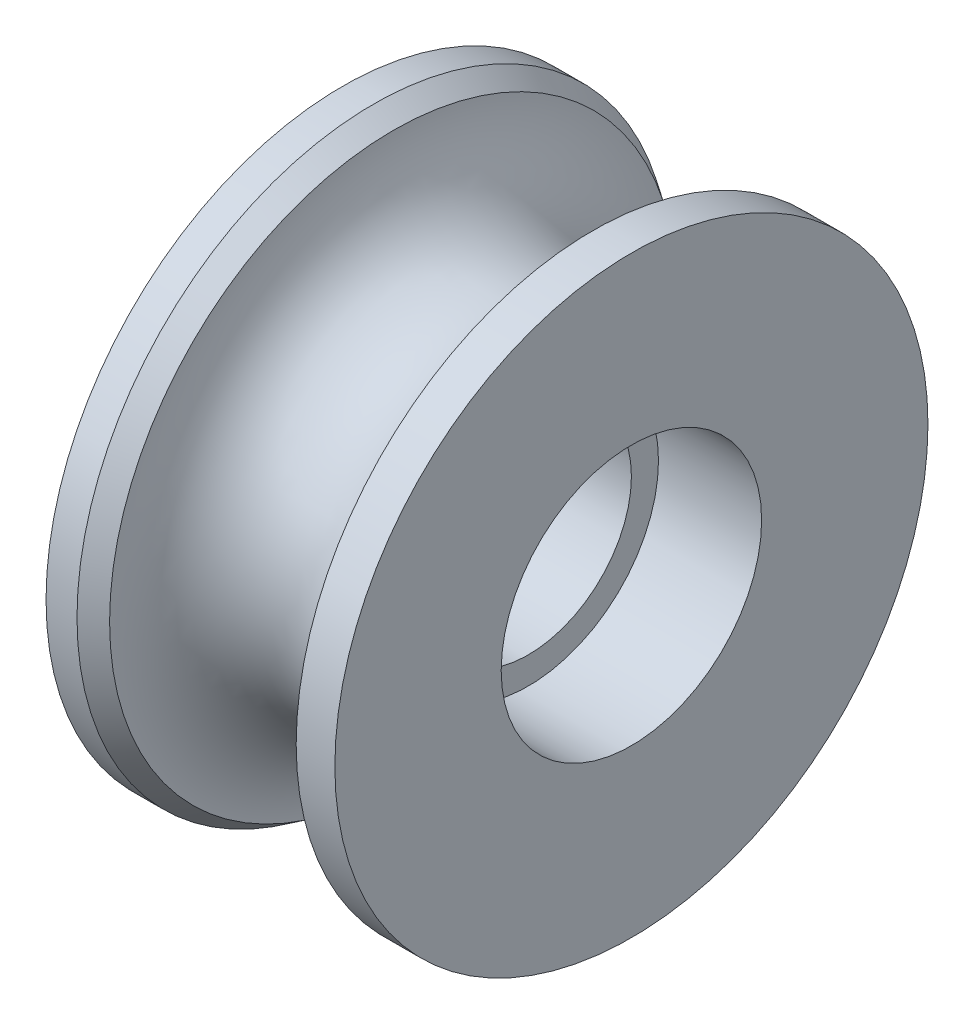
ISO-10303-21;
HEADER;
FILE_DESCRIPTION(('STEP AP214'),'2;1');
FILE_NAME('part.step','',(''),(''),'','','');
FILE_SCHEMA(('AUTOMOTIVE_DESIGN { 1 0 10303 214 1 1 1 1 }'));
ENDSEC;
DATA;
#1=APPLICATION_CONTEXT('core data for automotive mechanical design processes');
#2=APPLICATION_PROTOCOL_DEFINITION('international standard','automotive_design',2000,#1);
#3=PRODUCT_CONTEXT('',#1,'mechanical');
#4=PRODUCT('Part','Part','',(#3));
#5=PRODUCT_RELATED_PRODUCT_CATEGORY('part','',(#4));
#6=PRODUCT_DEFINITION_FORMATION('','',#4);
#7=PRODUCT_DEFINITION_CONTEXT('part definition',#1,'design');
#8=PRODUCT_DEFINITION('design','',#6,#7);
#9=PRODUCT_DEFINITION_SHAPE('','',#8);
#10=(LENGTH_UNIT() NAMED_UNIT(*) SI_UNIT(.MILLI.,.METRE.));
#11=(NAMED_UNIT(*) PLANE_ANGLE_UNIT() SI_UNIT($,.RADIAN.));
#12=(NAMED_UNIT(*) SI_UNIT($,.STERADIAN.) SOLID_ANGLE_UNIT());
#13=UNCERTAINTY_MEASURE_WITH_UNIT(LENGTH_MEASURE(1.E-05),#10,'distance_accuracy_value','');
#14=(GEOMETRIC_REPRESENTATION_CONTEXT(3) GLOBAL_UNCERTAINTY_ASSIGNED_CONTEXT((#13)) GLOBAL_UNIT_ASSIGNED_CONTEXT((#10,
#11,#12)) REPRESENTATION_CONTEXT('',''));
#15=CARTESIAN_POINT('',(0.,0.,0.));
#16=DIRECTION('',(0.,0.,1.));
#17=DIRECTION('',(1.,0.,0.));
#18=AXIS2_PLACEMENT_3D('',#15,#16,#17);
#19=CARTESIAN_POINT('',(23.368,12.7,26.70175));
#20=DIRECTION('',(1.,0.,0.));
#21=DIRECTION('',(0.,0.,-1.));
#22=AXIS2_PLACEMENT_3D('',#19,#20,#21);
#23=PLANE('',#22);
#24=CARTESIAN_POINT('',(23.368,12.7,20.955));
#25=DIRECTION('',(1.,0.,0.));
#26=DIRECTION('',(0.,0.,-1.));
#27=AXIS2_PLACEMENT_3D('',#24,#25,#26);
#28=CIRCLE('',#27,6.4135);
#29=CARTESIAN_POINT('',(23.368,12.7,14.5415));
#30=VERTEX_POINT('',#29);
#31=EDGE_CURVE('E57',#30,#30,#28,.T.);
#32=ORIENTED_EDGE('',*,*,#31,.F.);
#33=EDGE_LOOP('',(#32));
#34=FACE_BOUND('',#33,.T.);
#35=CARTESIAN_POINT('',(23.368,12.7,20.955));
#36=DIRECTION('',(1.,0.,0.));
#37=DIRECTION('',(0.,0.,-1.));
#38=AXIS2_PLACEMENT_3D('',#35,#36,#37);
#39=CIRCLE('',#38,5.08);
#40=CARTESIAN_POINT('',(23.368,12.7,15.875));
#41=VERTEX_POINT('',#40);
#42=EDGE_CURVE('E36',#41,#41,#39,.T.);
#43=ORIENTED_EDGE('',*,*,#42,.T.);
#44=EDGE_LOOP('',(#43));
#45=FACE_BOUND('',#44,.T.);
#46=ADVANCED_FACE('F15',(#34,#45),#23,.F.);
#47=CARTESIAN_POINT('',(25.4,12.7,20.955));
#48=DIRECTION('',(1.,0.,0.));
#49=DIRECTION('',(0.,0.,-1.));
#50=AXIS2_PLACEMENT_3D('',#47,#48,#49);
#51=CYLINDRICAL_SURFACE('',#50,5.08);
#52=ORIENTED_EDGE('',*,*,#42,.F.);
#53=EDGE_LOOP('',(#52));
#54=FACE_BOUND('',#53,.T.);
#55=CARTESIAN_POINT('',(27.432,12.7,20.955));
#56=DIRECTION('',(1.,0.,0.));
#57=DIRECTION('',(0.,0.,-1.));
#58=AXIS2_PLACEMENT_3D('',#55,#56,#57);
#59=CIRCLE('',#58,5.08);
#60=CARTESIAN_POINT('',(27.432,12.7,15.875));
#61=VERTEX_POINT('',#60);
#62=EDGE_CURVE('E39',#61,#61,#59,.T.);
#63=ORIENTED_EDGE('',*,*,#62,.T.);
#64=EDGE_LOOP('',(#63));
#65=FACE_BOUND('',#64,.T.);
#66=ADVANCED_FACE('F65',(#54,#65),#51,.F.);
#67=CARTESIAN_POINT('',(27.432,12.7,26.70175));
#68=DIRECTION('',(-1.,0.,0.));
#69=DIRECTION('',(0.,0.,1.));
#70=AXIS2_PLACEMENT_3D('',#67,#68,#69);
#71=PLANE('',#70);
#72=ORIENTED_EDGE('',*,*,#62,.F.);
#73=EDGE_LOOP('',(#72));
#74=FACE_BOUND('',#73,.T.);
#75=CARTESIAN_POINT('',(27.432,12.7,20.955));
#76=DIRECTION('',(1.,0.,0.));
#77=DIRECTION('',(0.,0.,-1.));
#78=AXIS2_PLACEMENT_3D('',#75,#76,#77);
#79=CIRCLE('',#78,6.4135);
#80=CARTESIAN_POINT('',(27.432,12.7,14.5415));
#81=VERTEX_POINT('',#80);
#82=EDGE_CURVE('E42',#81,#81,#79,.T.);
#83=ORIENTED_EDGE('',*,*,#82,.T.);
#84=EDGE_LOOP('',(#83));
#85=FACE_BOUND('',#84,.T.);
#86=ADVANCED_FACE('F71',(#74,#85),#71,.F.);
#87=CARTESIAN_POINT('',(25.4,12.7,20.955));
#88=DIRECTION('',(1.,0.,0.));
#89=DIRECTION('',(0.,0.,-1.));
#90=AXIS2_PLACEMENT_3D('',#87,#88,#89);
#91=CYLINDRICAL_SURFACE('',#90,6.4135);
#92=ORIENTED_EDGE('',*,*,#82,.F.);
#93=EDGE_LOOP('',(#92));
#94=FACE_BOUND('',#93,.T.);
#95=CARTESIAN_POINT('',(32.512,12.7,20.955));
#96=DIRECTION('',(1.,0.,0.));
#97=DIRECTION('',(0.,0.,-1.));
#98=AXIS2_PLACEMENT_3D('',#95,#96,#97);
#99=CIRCLE('',#98,6.4135);
#100=CARTESIAN_POINT('',(32.512,12.7,14.5415));
#101=VERTEX_POINT('',#100);
#102=EDGE_CURVE('E45',#101,#101,#99,.T.);
#103=ORIENTED_EDGE('',*,*,#102,.T.);
#104=EDGE_LOOP('',(#103));
#105=FACE_BOUND('',#104,.T.);
#106=ADVANCED_FACE('F77',(#94,#105),#91,.F.);
#107=CARTESIAN_POINT('',(32.512,12.7,31.46425));
#108=DIRECTION('',(1.,0.,0.));
#109=DIRECTION('',(0.,0.,-1.));
#110=AXIS2_PLACEMENT_3D('',#107,#108,#109);
#111=PLANE('',#110);
#112=CARTESIAN_POINT('',(32.512,12.7,20.955));
#113=DIRECTION('',(1.,0.,0.));
#114=DIRECTION('',(0.,0.,-1.));
#115=AXIS2_PLACEMENT_3D('',#112,#113,#114);
#116=CIRCLE('',#115,14.605);
#117=CARTESIAN_POINT('',(32.512,12.7,6.35));
#118=VERTEX_POINT('',#117);
#119=EDGE_CURVE('E48',#118,#118,#116,.T.);
#120=ORIENTED_EDGE('',*,*,#119,.T.);
#121=EDGE_LOOP('',(#120));
#122=FACE_BOUND('',#121,.T.);
#123=ORIENTED_EDGE('',*,*,#102,.F.);
#124=EDGE_LOOP('',(#123));
#125=FACE_BOUND('',#124,.T.);
#126=ADVANCED_FACE('F83',(#122,#125),#111,.T.);
#127=CARTESIAN_POINT('',(25.4,12.7,20.955));
#128=DIRECTION('',(1.,0.,0.));
#129=DIRECTION('',(0.,0.,-1.));
#130=AXIS2_PLACEMENT_3D('',#127,#128,#129);
#131=CYLINDRICAL_SURFACE('',#130,14.605);
#132=CARTESIAN_POINT('',(30.607,12.7,20.955));
#133=DIRECTION('',(1.,0.,0.));
#134=DIRECTION('',(0.,0.,-1.));
#135=AXIS2_PLACEMENT_3D('',#132,#133,#134);
#136=CIRCLE('',#135,14.605);
#137=CARTESIAN_POINT('',(30.607,12.7,6.35));
#138=VERTEX_POINT('',#137);
#139=EDGE_CURVE('E31',#138,#138,#136,.T.);
#140=ORIENTED_EDGE('',*,*,#139,.T.);
#141=EDGE_LOOP('',(#140));
#142=FACE_BOUND('',#141,.T.);
#143=ORIENTED_EDGE('',*,*,#119,.F.);
#144=EDGE_LOOP('',(#143));
#145=FACE_BOUND('',#144,.T.);
#146=ADVANCED_FACE('F88',(#142,#145),#131,.T.);
#147=CARTESIAN_POINT('',(25.4,12.7,20.955));
#148=DIRECTION('',(1.,0.,0.));
#149=DIRECTION('',(0.,0.,-1.));
#150=AXIS2_PLACEMENT_3D('',#147,#148,#149);
#151=TOROIDAL_SURFACE('',#150,13.97,4.6158865887281);
#152=CARTESIAN_POINT('',(30.0001679798497,12.7,20.955));
#153=DIRECTION('',(-1.,0.,0.));
#154=DIRECTION('',(0.,0.,1.));
#155=AXIS2_PLACEMENT_3D('',#152,#153,#154);
#156=CIRCLE('',#155,13.5893905450857);
#157=CARTESIAN_POINT('',(30.0001679798497,12.7,34.5443905450857));
#158=VERTEX_POINT('',#157);
#159=EDGE_CURVE('E23',#158,#158,#156,.T.);
#160=ORIENTED_EDGE('',*,*,#159,.T.);
#161=EDGE_LOOP('',(#160));
#162=FACE_BOUND('',#161,.T.);
#163=CARTESIAN_POINT('',(20.7841137104067,12.7,20.955));
#164=DIRECTION('',(1.,0.,0.));
#165=DIRECTION('',(0.,0.,-1.));
#166=AXIS2_PLACEMENT_3D('',#163,#164,#165);
#167=CIRCLE('',#166,13.9715183591693);
#168=CARTESIAN_POINT('',(20.7841137104067,12.7,6.98348164083074));
#169=VERTEX_POINT('',#168);
#170=EDGE_CURVE('E27',#169,#169,#167,.T.);
#171=ORIENTED_EDGE('',*,*,#170,.T.);
#172=EDGE_LOOP('',(#171));
#173=FACE_BOUND('',#172,.T.);
#174=ADVANCED_FACE('F95',(#162,#173),#151,.F.);
#175=CARTESIAN_POINT('',(25.4,12.7,20.955));
#176=DIRECTION('',(1.,0.,0.));
#177=DIRECTION('',(0.,0.,-1.));
#178=AXIS2_PLACEMENT_3D('',#175,#176,#177);
#179=CYLINDRICAL_SURFACE('',#178,14.605);
#180=CARTESIAN_POINT('',(19.812,12.7,20.955));
#181=DIRECTION('',(-1.,0.,0.));
#182=DIRECTION('',(0.,0.,1.));
#183=AXIS2_PLACEMENT_3D('',#180,#181,#182);
#184=CIRCLE('',#183,14.605);
#185=CARTESIAN_POINT('',(19.812,12.7,35.56));
#186=VERTEX_POINT('',#185);
#187=EDGE_CURVE('E10',#186,#186,#184,.T.);
#188=ORIENTED_EDGE('',*,*,#187,.T.);
#189=EDGE_LOOP('',(#188));
#190=FACE_BOUND('',#189,.T.);
#191=CARTESIAN_POINT('',(18.288,12.7,20.955));
#192=DIRECTION('',(1.,0.,0.));
#193=DIRECTION('',(0.,0.,-1.));
#194=AXIS2_PLACEMENT_3D('',#191,#192,#193);
#195=CIRCLE('',#194,14.605);
#196=CARTESIAN_POINT('',(18.288,12.7,6.35));
#197=VERTEX_POINT('',#196);
#198=EDGE_CURVE('E51',#197,#197,#195,.T.);
#199=ORIENTED_EDGE('',*,*,#198,.T.);
#200=EDGE_LOOP('',(#199));
#201=FACE_BOUND('',#200,.T.);
#202=ADVANCED_FACE('F121',(#190,#201),#179,.T.);
#203=CARTESIAN_POINT('',(18.288,12.7,31.46425));
#204=DIRECTION('',(1.,0.,0.));
#205=DIRECTION('',(0.,0.,-1.));
#206=AXIS2_PLACEMENT_3D('',#203,#204,#205);
#207=PLANE('',#206);
#208=ORIENTED_EDGE('',*,*,#198,.F.);
#209=EDGE_LOOP('',(#208));
#210=FACE_BOUND('',#209,.T.);
#211=CARTESIAN_POINT('',(18.288,12.7,20.955));
#212=DIRECTION('',(1.,0.,0.));
#213=DIRECTION('',(0.,0.,-1.));
#214=AXIS2_PLACEMENT_3D('',#211,#212,#213);
#215=CIRCLE('',#214,6.4135);
#216=CARTESIAN_POINT('',(18.288,12.7,14.5415));
#217=VERTEX_POINT('',#216);
#218=EDGE_CURVE('E54',#217,#217,#215,.T.);
#219=ORIENTED_EDGE('',*,*,#218,.T.);
#220=EDGE_LOOP('',(#219));
#221=FACE_BOUND('',#220,.T.);
#222=ADVANCED_FACE('F111',(#210,#221),#207,.F.);
#223=CARTESIAN_POINT('',(25.4,12.7,20.955));
#224=DIRECTION('',(1.,0.,0.));
#225=DIRECTION('',(0.,0.,-1.));
#226=AXIS2_PLACEMENT_3D('',#223,#224,#225);
#227=CYLINDRICAL_SURFACE('',#226,6.4135);
#228=ORIENTED_EDGE('',*,*,#218,.F.);
#229=EDGE_LOOP('',(#228));
#230=FACE_BOUND('',#229,.T.);
#231=ORIENTED_EDGE('',*,*,#31,.T.);
#232=EDGE_LOOP('',(#231));
#233=FACE_BOUND('',#232,.T.);
#234=ADVANCED_FACE('F61',(#230,#233),#227,.F.);
#235=CARTESIAN_POINT('',(30.607,12.7,20.955));
#236=DIRECTION('',(1.,0.,0.));
#237=DIRECTION('',(0.,0.,-1.));
#238=AXIS2_PLACEMENT_3D('',#235,#236,#237);
#239=CONICAL_SURFACE('',#238,14.605,1.03221319242554);
#240=ORIENTED_EDGE('',*,*,#159,.F.);
#241=EDGE_LOOP('',(#240));
#242=FACE_BOUND('',#241,.T.);
#243=ORIENTED_EDGE('',*,*,#139,.F.);
#244=EDGE_LOOP('',(#243));
#245=FACE_BOUND('',#244,.T.);
#246=ADVANCED_FACE('F100',(#242,#245),#239,.T.);
#247=CARTESIAN_POINT('',(20.784113660998,12.7,20.955));
#248=DIRECTION('',(-1.,0.,0.));
#249=DIRECTION('',(0.,0.,1.));
#250=AXIS2_PLACEMENT_3D('',#247,#248,#249);
#251=CONICAL_SURFACE('',#250,13.9715183591855,0.577537000690852);
#252=ORIENTED_EDGE('',*,*,#187,.F.);
#253=EDGE_LOOP('',(#252));
#254=FACE_BOUND('',#253,.T.);
#255=ORIENTED_EDGE('',*,*,#170,.F.);
#256=EDGE_LOOP('',(#255));
#257=FACE_BOUND('',#256,.T.);
#258=ADVANCED_FACE('F18',(#254,#257),#251,.T.);
#259=CLOSED_SHELL('',(#46,#66,#86,#106,#126,#146,#174,#202,#222,#234,#246,#258));
#260=MANIFOLD_SOLID_BREP('B1',#259);
#261=ADVANCED_BREP_SHAPE_REPRESENTATION('',(#18,#260),#14);
#262=SHAPE_DEFINITION_REPRESENTATION(#9,#261);
ENDSEC;
END-ISO-10303-21;
